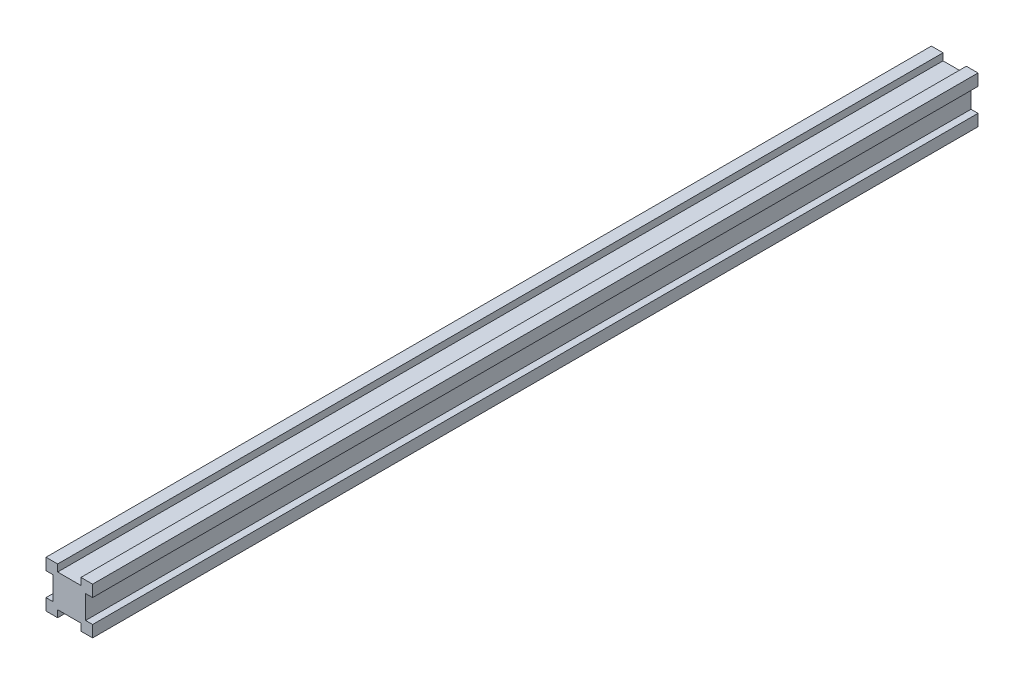
ISO-10303-21;
HEADER;
FILE_DESCRIPTION(('STEP AP214'),'2;1');
FILE_NAME('part.step','',(''),(''),'','','');
FILE_SCHEMA(('AUTOMOTIVE_DESIGN { 1 0 10303 214 1 1 1 1 }'));
ENDSEC;
DATA;
#1=APPLICATION_CONTEXT('core data for automotive mechanical design processes');
#2=APPLICATION_PROTOCOL_DEFINITION('international standard','automotive_design',2000,#1);
#3=PRODUCT_CONTEXT('',#1,'mechanical');
#4=PRODUCT('Part','Part','',(#3));
#5=PRODUCT_RELATED_PRODUCT_CATEGORY('part','',(#4));
#6=PRODUCT_DEFINITION_FORMATION('','',#4);
#7=PRODUCT_DEFINITION_CONTEXT('part definition',#1,'design');
#8=PRODUCT_DEFINITION('design','',#6,#7);
#9=PRODUCT_DEFINITION_SHAPE('','',#8);
#10=(LENGTH_UNIT() NAMED_UNIT(*) SI_UNIT(.MILLI.,.METRE.));
#11=(NAMED_UNIT(*) PLANE_ANGLE_UNIT() SI_UNIT($,.RADIAN.));
#12=(NAMED_UNIT(*) SI_UNIT($,.STERADIAN.) SOLID_ANGLE_UNIT());
#13=UNCERTAINTY_MEASURE_WITH_UNIT(LENGTH_MEASURE(1.E-05),#10,'distance_accuracy_value','');
#14=(GEOMETRIC_REPRESENTATION_CONTEXT(3) GLOBAL_UNCERTAINTY_ASSIGNED_CONTEXT((#13)) GLOBAL_UNIT_ASSIGNED_CONTEXT((#10,
#11,#12)) REPRESENTATION_CONTEXT('',''));
#15=CARTESIAN_POINT('',(0.,0.,0.));
#16=DIRECTION('',(0.,0.,1.));
#17=DIRECTION('',(1.,0.,0.));
#18=AXIS2_PLACEMENT_3D('',#15,#16,#17);
#19=CARTESIAN_POINT('',(-10.,0.,190.));
#20=DIRECTION('',(-1.,0.,0.));
#21=DIRECTION('',(0.,-1.,0.));
#22=AXIS2_PLACEMENT_3D('',#19,#20,#21);
#23=PLANE('',#22);
#24=DIRECTION('',(0.,1.,0.));
#25=VECTOR('',#24,1.);
#26=CARTESIAN_POINT('',(-10.,0.,-190.));
#27=LINE('',#26,#25);
#28=CARTESIAN_POINT('',(-10.,5.,-190.));
#29=VERTEX_POINT('',#28);
#30=CARTESIAN_POINT('',(-10.,10.,-190.));
#31=VERTEX_POINT('',#30);
#32=EDGE_CURVE('E204',#29,#31,#27,.T.);
#33=ORIENTED_EDGE('',*,*,#32,.F.);
#34=DIRECTION('',(0.,0.,-1.));
#35=VECTOR('',#34,1.);
#36=CARTESIAN_POINT('',(-10.,5.,190.));
#37=LINE('',#36,#35);
#38=CARTESIAN_POINT('',(-10.,5.,190.));
#39=VERTEX_POINT('',#38);
#40=EDGE_CURVE('E11',#39,#29,#37,.T.);
#41=ORIENTED_EDGE('',*,*,#40,.F.);
#42=DIRECTION('',(0.,1.,0.));
#43=VECTOR('',#42,1.);
#44=CARTESIAN_POINT('',(-10.,0.,190.));
#45=LINE('',#44,#43);
#46=CARTESIAN_POINT('',(-10.,10.,190.));
#47=VERTEX_POINT('',#46);
#48=EDGE_CURVE('E258',#39,#47,#45,.T.);
#49=ORIENTED_EDGE('',*,*,#48,.T.);
#50=DIRECTION('',(0.,0.,-1.));
#51=VECTOR('',#50,1.);
#52=CARTESIAN_POINT('',(-10.,10.,190.));
#53=LINE('',#52,#51);
#54=EDGE_CURVE('E55',#47,#31,#53,.T.);
#55=ORIENTED_EDGE('',*,*,#54,.T.);
#56=EDGE_LOOP('',(#33,#41,#49,#55));
#57=FACE_BOUND('',#56,.T.);
#58=ADVANCED_FACE('F39',(#57),#23,.T.);
#59=CARTESIAN_POINT('',(0.,5.,190.));
#60=DIRECTION('',(0.,-1.,0.));
#61=DIRECTION('',(1.,0.,0.));
#62=AXIS2_PLACEMENT_3D('',#59,#60,#61);
#63=PLANE('',#62);
#64=DIRECTION('',(-1.,0.,0.));
#65=VECTOR('',#64,1.);
#66=CARTESIAN_POINT('',(0.,5.,-190.));
#67=LINE('',#66,#65);
#68=CARTESIAN_POINT('',(-7.,5.,-190.));
#69=VERTEX_POINT('',#68);
#70=EDGE_CURVE('E206',#69,#29,#67,.T.);
#71=ORIENTED_EDGE('',*,*,#70,.F.);
#72=DIRECTION('',(0.,0.,-1.));
#73=VECTOR('',#72,1.);
#74=CARTESIAN_POINT('',(-7.,5.,190.));
#75=LINE('',#74,#73);
#76=CARTESIAN_POINT('',(-7.,5.,190.));
#77=VERTEX_POINT('',#76);
#78=EDGE_CURVE('E47',#77,#69,#75,.T.);
#79=ORIENTED_EDGE('',*,*,#78,.F.);
#80=DIRECTION('',(-1.,0.,0.));
#81=VECTOR('',#80,1.);
#82=CARTESIAN_POINT('',(0.,5.,190.));
#83=LINE('',#82,#81);
#84=EDGE_CURVE('E313',#77,#39,#83,.T.);
#85=ORIENTED_EDGE('',*,*,#84,.T.);
#86=ORIENTED_EDGE('',*,*,#40,.T.);
#87=EDGE_LOOP('',(#71,#79,#85,#86));
#88=FACE_BOUND('',#87,.T.);
#89=ADVANCED_FACE('F300',(#88),#63,.T.);
#90=CARTESIAN_POINT('',(-7.,0.,190.));
#91=DIRECTION('',(-1.,0.,0.));
#92=DIRECTION('',(0.,-1.,0.));
#93=AXIS2_PLACEMENT_3D('',#90,#91,#92);
#94=PLANE('',#93);
#95=DIRECTION('',(0.,1.,0.));
#96=VECTOR('',#95,1.);
#97=CARTESIAN_POINT('',(-7.,0.,-190.));
#98=LINE('',#97,#96);
#99=CARTESIAN_POINT('',(-7.,-5.,-190.));
#100=VERTEX_POINT('',#99);
#101=EDGE_CURVE('E209',#100,#69,#98,.T.);
#102=ORIENTED_EDGE('',*,*,#101,.F.);
#103=DIRECTION('',(0.,0.,-1.));
#104=VECTOR('',#103,1.);
#105=CARTESIAN_POINT('',(-7.,-5.,190.));
#106=LINE('',#105,#104);
#107=CARTESIAN_POINT('',(-7.,-5.,190.));
#108=VERTEX_POINT('',#107);
#109=EDGE_CURVE('E289',#108,#100,#106,.T.);
#110=ORIENTED_EDGE('',*,*,#109,.F.);
#111=DIRECTION('',(0.,1.,0.));
#112=VECTOR('',#111,1.);
#113=CARTESIAN_POINT('',(-7.,0.,190.));
#114=LINE('',#113,#112);
#115=EDGE_CURVE('E296',#108,#77,#114,.T.);
#116=ORIENTED_EDGE('',*,*,#115,.T.);
#117=ORIENTED_EDGE('',*,*,#78,.T.);
#118=EDGE_LOOP('',(#102,#110,#116,#117));
#119=FACE_BOUND('',#118,.T.);
#120=ADVANCED_FACE('F294',(#119),#94,.T.);
#121=CARTESIAN_POINT('',(0.,-5.,190.));
#122=DIRECTION('',(0.,1.,0.));
#123=DIRECTION('',(-1.,0.,0.));
#124=AXIS2_PLACEMENT_3D('',#121,#122,#123);
#125=PLANE('',#124);
#126=DIRECTION('',(1.,0.,0.));
#127=VECTOR('',#126,1.);
#128=CARTESIAN_POINT('',(0.,-5.,-190.));
#129=LINE('',#128,#127);
#130=CARTESIAN_POINT('',(-10.,-5.,-190.));
#131=VERTEX_POINT('',#130);
#132=EDGE_CURVE('E212',#131,#100,#129,.T.);
#133=ORIENTED_EDGE('',*,*,#132,.F.);
#134=DIRECTION('',(0.,0.,-1.));
#135=VECTOR('',#134,1.);
#136=CARTESIAN_POINT('',(-10.,-5.,190.));
#137=LINE('',#136,#135);
#138=CARTESIAN_POINT('',(-10.,-5.,190.));
#139=VERTEX_POINT('',#138);
#140=EDGE_CURVE('E287',#139,#131,#137,.T.);
#141=ORIENTED_EDGE('',*,*,#140,.F.);
#142=DIRECTION('',(1.,0.,0.));
#143=VECTOR('',#142,1.);
#144=CARTESIAN_POINT('',(0.,-5.,190.));
#145=LINE('',#144,#143);
#146=EDGE_CURVE('E310',#139,#108,#145,.T.);
#147=ORIENTED_EDGE('',*,*,#146,.T.);
#148=ORIENTED_EDGE('',*,*,#109,.T.);
#149=EDGE_LOOP('',(#133,#141,#147,#148));
#150=FACE_BOUND('',#149,.T.);
#151=ADVANCED_FACE('F307',(#150),#125,.T.);
#152=CARTESIAN_POINT('',(-9.99999999999999,0.,190.));
#153=DIRECTION('',(-1.,0.,0.));
#154=DIRECTION('',(0.,-1.,0.));
#155=AXIS2_PLACEMENT_3D('',#152,#153,#154);
#156=PLANE('',#155);
#157=DIRECTION('',(0.,1.,0.));
#158=VECTOR('',#157,1.);
#159=CARTESIAN_POINT('',(-9.99999999999999,0.,-190.));
#160=LINE('',#159,#158);
#161=CARTESIAN_POINT('',(-10.,-10.,-190.));
#162=VERTEX_POINT('',#161);
#163=EDGE_CURVE('E215',#162,#131,#160,.T.);
#164=ORIENTED_EDGE('',*,*,#163,.F.);
#165=DIRECTION('',(0.,0.,-1.));
#166=VECTOR('',#165,1.);
#167=CARTESIAN_POINT('',(-10.,-10.,190.));
#168=LINE('',#167,#166);
#169=CARTESIAN_POINT('',(-10.,-10.,190.));
#170=VERTEX_POINT('',#169);
#171=EDGE_CURVE('E285',#170,#162,#168,.T.);
#172=ORIENTED_EDGE('',*,*,#171,.F.);
#173=DIRECTION('',(0.,1.,0.));
#174=VECTOR('',#173,1.);
#175=CARTESIAN_POINT('',(-9.99999999999999,0.,190.));
#176=LINE('',#175,#174);
#177=EDGE_CURVE('E315',#170,#139,#176,.T.);
#178=ORIENTED_EDGE('',*,*,#177,.T.);
#179=ORIENTED_EDGE('',*,*,#140,.T.);
#180=EDGE_LOOP('',(#164,#172,#178,#179));
#181=FACE_BOUND('',#180,.T.);
#182=ADVANCED_FACE('F373',(#181),#156,.T.);
#183=CARTESIAN_POINT('',(0.,-10.,190.));
#184=DIRECTION('',(0.,1.,0.));
#185=DIRECTION('',(0.,0.,1.));
#186=AXIS2_PLACEMENT_3D('',#183,#184,#185);
#187=PLANE('',#186);
#188=DIRECTION('',(1.,0.,0.));
#189=VECTOR('',#188,1.);
#190=CARTESIAN_POINT('',(0.,-10.,-190.));
#191=LINE('',#190,#189);
#192=CARTESIAN_POINT('',(-5.,-10.,-190.));
#193=VERTEX_POINT('',#192);
#194=EDGE_CURVE('E218',#162,#193,#191,.T.);
#195=ORIENTED_EDGE('',*,*,#194,.T.);
#196=DIRECTION('',(0.,0.,-1.));
#197=VECTOR('',#196,1.);
#198=CARTESIAN_POINT('',(-5.,-10.,190.));
#199=LINE('',#198,#197);
#200=CARTESIAN_POINT('',(-5.,-10.,190.));
#201=VERTEX_POINT('',#200);
#202=EDGE_CURVE('E283',#201,#193,#199,.T.);
#203=ORIENTED_EDGE('',*,*,#202,.F.);
#204=DIRECTION('',(1.,0.,0.));
#205=VECTOR('',#204,1.);
#206=CARTESIAN_POINT('',(0.,-10.,190.));
#207=LINE('',#206,#205);
#208=EDGE_CURVE('E321',#170,#201,#207,.T.);
#209=ORIENTED_EDGE('',*,*,#208,.F.);
#210=ORIENTED_EDGE('',*,*,#171,.T.);
#211=EDGE_LOOP('',(#195,#203,#209,#210));
#212=FACE_BOUND('',#211,.T.);
#213=ADVANCED_FACE('F376',(#212),#187,.F.);
#214=CARTESIAN_POINT('',(-5.,0.,190.));
#215=DIRECTION('',(1.,0.,0.));
#216=DIRECTION('',(0.,0.,-1.));
#217=AXIS2_PLACEMENT_3D('',#214,#215,#216);
#218=PLANE('',#217);
#219=DIRECTION('',(0.,-1.,0.));
#220=VECTOR('',#219,1.);
#221=CARTESIAN_POINT('',(-5.,0.,-190.));
#222=LINE('',#221,#220);
#223=CARTESIAN_POINT('',(-5.,-7.,-190.));
#224=VERTEX_POINT('',#223);
#225=EDGE_CURVE('E221',#224,#193,#222,.T.);
#226=ORIENTED_EDGE('',*,*,#225,.F.);
#227=DIRECTION('',(0.,0.,-1.));
#228=VECTOR('',#227,1.);
#229=CARTESIAN_POINT('',(-5.,-7.,190.));
#230=LINE('',#229,#228);
#231=CARTESIAN_POINT('',(-5.,-7.,190.));
#232=VERTEX_POINT('',#231);
#233=EDGE_CURVE('E281',#232,#224,#230,.T.);
#234=ORIENTED_EDGE('',*,*,#233,.F.);
#235=DIRECTION('',(0.,-1.,0.));
#236=VECTOR('',#235,1.);
#237=CARTESIAN_POINT('',(-5.,0.,190.));
#238=LINE('',#237,#236);
#239=EDGE_CURVE('E323',#232,#201,#238,.T.);
#240=ORIENTED_EDGE('',*,*,#239,.T.);
#241=ORIENTED_EDGE('',*,*,#202,.T.);
#242=EDGE_LOOP('',(#226,#234,#240,#241));
#243=FACE_BOUND('',#242,.T.);
#244=ADVANCED_FACE('F378',(#243),#218,.T.);
#245=CARTESIAN_POINT('',(0.,-7.,190.));
#246=DIRECTION('',(0.,-1.,0.));
#247=DIRECTION('',(1.,0.,0.));
#248=AXIS2_PLACEMENT_3D('',#245,#246,#247);
#249=PLANE('',#248);
#250=DIRECTION('',(-1.,0.,0.));
#251=VECTOR('',#250,1.);
#252=CARTESIAN_POINT('',(0.,-7.,-190.));
#253=LINE('',#252,#251);
#254=CARTESIAN_POINT('',(5.,-7.,-190.));
#255=VERTEX_POINT('',#254);
#256=EDGE_CURVE('E225',#255,#224,#253,.T.);
#257=ORIENTED_EDGE('',*,*,#256,.F.);
#258=DIRECTION('',(0.,0.,-1.));
#259=VECTOR('',#258,1.);
#260=CARTESIAN_POINT('',(5.,-7.,190.));
#261=LINE('',#260,#259);
#262=CARTESIAN_POINT('',(5.,-7.,190.));
#263=VERTEX_POINT('',#262);
#264=EDGE_CURVE('E279',#263,#255,#261,.T.);
#265=ORIENTED_EDGE('',*,*,#264,.F.);
#266=DIRECTION('',(-1.,0.,0.));
#267=VECTOR('',#266,1.);
#268=CARTESIAN_POINT('',(0.,-7.,190.));
#269=LINE('',#268,#267);
#270=EDGE_CURVE('E327',#263,#232,#269,.T.);
#271=ORIENTED_EDGE('',*,*,#270,.T.);
#272=ORIENTED_EDGE('',*,*,#233,.T.);
#273=EDGE_LOOP('',(#257,#265,#271,#272));
#274=FACE_BOUND('',#273,.T.);
#275=ADVANCED_FACE('F381',(#274),#249,.T.);
#276=CARTESIAN_POINT('',(5.,0.,190.));
#277=DIRECTION('',(-1.,0.,0.));
#278=DIRECTION('',(0.,0.,1.));
#279=AXIS2_PLACEMENT_3D('',#276,#277,#278);
#280=PLANE('',#279);
#281=DIRECTION('',(0.,1.,0.));
#282=VECTOR('',#281,1.);
#283=CARTESIAN_POINT('',(5.,0.,-190.));
#284=LINE('',#283,#282);
#285=CARTESIAN_POINT('',(5.,-10.,-190.));
#286=VERTEX_POINT('',#285);
#287=EDGE_CURVE('E228',#286,#255,#284,.T.);
#288=ORIENTED_EDGE('',*,*,#287,.F.);
#289=DIRECTION('',(0.,0.,-1.));
#290=VECTOR('',#289,1.);
#291=CARTESIAN_POINT('',(5.,-10.,190.));
#292=LINE('',#291,#290);
#293=CARTESIAN_POINT('',(5.,-10.,190.));
#294=VERTEX_POINT('',#293);
#295=EDGE_CURVE('E277',#294,#286,#292,.T.);
#296=ORIENTED_EDGE('',*,*,#295,.F.);
#297=DIRECTION('',(0.,1.,0.));
#298=VECTOR('',#297,1.);
#299=CARTESIAN_POINT('',(5.,0.,190.));
#300=LINE('',#299,#298);
#301=EDGE_CURVE('E330',#294,#263,#300,.T.);
#302=ORIENTED_EDGE('',*,*,#301,.T.);
#303=ORIENTED_EDGE('',*,*,#264,.T.);
#304=EDGE_LOOP('',(#288,#296,#302,#303));
#305=FACE_BOUND('',#304,.T.);
#306=ADVANCED_FACE('F385',(#305),#280,.T.);
#307=CARTESIAN_POINT('',(10.,-10.,-190.));
#308=VERTEX_POINT('',#307);
#309=EDGE_CURVE('E222',#286,#308,#191,.T.);
#310=ORIENTED_EDGE('',*,*,#309,.T.);
#311=DIRECTION('',(0.,0.,-1.));
#312=VECTOR('',#311,1.);
#313=CARTESIAN_POINT('',(10.,-10.,190.));
#314=LINE('',#313,#312);
#315=CARTESIAN_POINT('',(10.,-10.,190.));
#316=VERTEX_POINT('',#315);
#317=EDGE_CURVE('E274',#316,#308,#314,.T.);
#318=ORIENTED_EDGE('',*,*,#317,.F.);
#319=EDGE_CURVE('E324',#294,#316,#207,.T.);
#320=ORIENTED_EDGE('',*,*,#319,.F.);
#321=ORIENTED_EDGE('',*,*,#295,.T.);
#322=EDGE_LOOP('',(#310,#318,#320,#321));
#323=FACE_BOUND('',#322,.T.);
#324=ADVANCED_FACE('F389',(#323),#187,.F.);
#325=CARTESIAN_POINT('',(10.,0.,190.));
#326=DIRECTION('',(-1.,0.,0.));
#327=DIRECTION('',(0.,0.,1.));
#328=AXIS2_PLACEMENT_3D('',#325,#326,#327);
#329=PLANE('',#328);
#330=DIRECTION('',(0.,1.,0.));
#331=VECTOR('',#330,1.);
#332=CARTESIAN_POINT('',(10.,0.,-190.));
#333=LINE('',#332,#331);
#334=CARTESIAN_POINT('',(10.,-5.,-190.));
#335=VERTEX_POINT('',#334);
#336=EDGE_CURVE('E231',#308,#335,#333,.T.);
#337=ORIENTED_EDGE('',*,*,#336,.T.);
#338=DIRECTION('',(0.,0.,-1.));
#339=VECTOR('',#338,1.);
#340=CARTESIAN_POINT('',(10.,-5.,190.));
#341=LINE('',#340,#339);
#342=CARTESIAN_POINT('',(10.,-5.,190.));
#343=VERTEX_POINT('',#342);
#344=EDGE_CURVE('E272',#343,#335,#341,.T.);
#345=ORIENTED_EDGE('',*,*,#344,.F.);
#346=DIRECTION('',(0.,1.,0.));
#347=VECTOR('',#346,1.);
#348=CARTESIAN_POINT('',(10.,0.,190.));
#349=LINE('',#348,#347);
#350=EDGE_CURVE('E333',#316,#343,#349,.T.);
#351=ORIENTED_EDGE('',*,*,#350,.F.);
#352=ORIENTED_EDGE('',*,*,#317,.T.);
#353=EDGE_LOOP('',(#337,#345,#351,#352));
#354=FACE_BOUND('',#353,.T.);
#355=ADVANCED_FACE('F393',(#354),#329,.F.);
#356=CARTESIAN_POINT('',(0.,-5.,190.));
#357=DIRECTION('',(0.,1.,0.));
#358=DIRECTION('',(-1.,0.,0.));
#359=AXIS2_PLACEMENT_3D('',#356,#357,#358);
#360=PLANE('',#359);
#361=DIRECTION('',(1.,0.,0.));
#362=VECTOR('',#361,1.);
#363=CARTESIAN_POINT('',(0.,-5.,-190.));
#364=LINE('',#363,#362);
#365=CARTESIAN_POINT('',(7.,-5.,-190.));
#366=VERTEX_POINT('',#365);
#367=EDGE_CURVE('E234',#366,#335,#364,.T.);
#368=ORIENTED_EDGE('',*,*,#367,.F.);
#369=DIRECTION('',(0.,0.,-1.));
#370=VECTOR('',#369,1.);
#371=CARTESIAN_POINT('',(7.,-5.,190.));
#372=LINE('',#371,#370);
#373=CARTESIAN_POINT('',(7.,-5.,190.));
#374=VERTEX_POINT('',#373);
#375=EDGE_CURVE('E270',#374,#366,#372,.T.);
#376=ORIENTED_EDGE('',*,*,#375,.F.);
#377=DIRECTION('',(1.,0.,0.));
#378=VECTOR('',#377,1.);
#379=CARTESIAN_POINT('',(0.,-5.,190.));
#380=LINE('',#379,#378);
#381=EDGE_CURVE('E335',#374,#343,#380,.T.);
#382=ORIENTED_EDGE('',*,*,#381,.T.);
#383=ORIENTED_EDGE('',*,*,#344,.T.);
#384=EDGE_LOOP('',(#368,#376,#382,#383));
#385=FACE_BOUND('',#384,.T.);
#386=ADVANCED_FACE('F397',(#385),#360,.T.);
#387=CARTESIAN_POINT('',(7.,0.,190.));
#388=DIRECTION('',(1.,0.,0.));
#389=DIRECTION('',(0.,0.,-1.));
#390=AXIS2_PLACEMENT_3D('',#387,#388,#389);
#391=PLANE('',#390);
#392=DIRECTION('',(0.,-1.,0.));
#393=VECTOR('',#392,1.);
#394=CARTESIAN_POINT('',(7.,0.,-190.));
#395=LINE('',#394,#393);
#396=CARTESIAN_POINT('',(7.,5.,-190.));
#397=VERTEX_POINT('',#396);
#398=EDGE_CURVE('E237',#397,#366,#395,.T.);
#399=ORIENTED_EDGE('',*,*,#398,.F.);
#400=DIRECTION('',(0.,0.,-1.));
#401=VECTOR('',#400,1.);
#402=CARTESIAN_POINT('',(7.,5.,190.));
#403=LINE('',#402,#401);
#404=CARTESIAN_POINT('',(7.,5.,190.));
#405=VERTEX_POINT('',#404);
#406=EDGE_CURVE('E268',#405,#397,#403,.T.);
#407=ORIENTED_EDGE('',*,*,#406,.F.);
#408=DIRECTION('',(0.,-1.,0.));
#409=VECTOR('',#408,1.);
#410=CARTESIAN_POINT('',(7.,0.,190.));
#411=LINE('',#410,#409);
#412=EDGE_CURVE('E338',#405,#374,#411,.T.);
#413=ORIENTED_EDGE('',*,*,#412,.T.);
#414=ORIENTED_EDGE('',*,*,#375,.T.);
#415=EDGE_LOOP('',(#399,#407,#413,#414));
#416=FACE_BOUND('',#415,.T.);
#417=ADVANCED_FACE('F401',(#416),#391,.T.);
#418=CARTESIAN_POINT('',(0.,5.,190.));
#419=DIRECTION('',(0.,-1.,0.));
#420=DIRECTION('',(1.,0.,0.));
#421=AXIS2_PLACEMENT_3D('',#418,#419,#420);
#422=PLANE('',#421);
#423=DIRECTION('',(-1.,0.,0.));
#424=VECTOR('',#423,1.);
#425=CARTESIAN_POINT('',(0.,5.,-190.));
#426=LINE('',#425,#424);
#427=CARTESIAN_POINT('',(10.,5.,-190.));
#428=VERTEX_POINT('',#427);
#429=EDGE_CURVE('E240',#428,#397,#426,.T.);
#430=ORIENTED_EDGE('',*,*,#429,.F.);
#431=DIRECTION('',(0.,0.,-1.));
#432=VECTOR('',#431,1.);
#433=CARTESIAN_POINT('',(10.,5.,190.));
#434=LINE('',#433,#432);
#435=CARTESIAN_POINT('',(10.,5.,190.));
#436=VERTEX_POINT('',#435);
#437=EDGE_CURVE('E266',#436,#428,#434,.T.);
#438=ORIENTED_EDGE('',*,*,#437,.F.);
#439=DIRECTION('',(-1.,0.,0.));
#440=VECTOR('',#439,1.);
#441=CARTESIAN_POINT('',(0.,5.,190.));
#442=LINE('',#441,#440);
#443=EDGE_CURVE('E341',#436,#405,#442,.T.);
#444=ORIENTED_EDGE('',*,*,#443,.T.);
#445=ORIENTED_EDGE('',*,*,#406,.T.);
#446=EDGE_LOOP('',(#430,#438,#444,#445));
#447=FACE_BOUND('',#446,.T.);
#448=ADVANCED_FACE('F405',(#447),#422,.T.);
#449=CARTESIAN_POINT('',(10.,0.,190.));
#450=DIRECTION('',(-1.,0.,0.));
#451=DIRECTION('',(0.,0.,1.));
#452=AXIS2_PLACEMENT_3D('',#449,#450,#451);
#453=PLANE('',#452);
#454=DIRECTION('',(0.,1.,0.));
#455=VECTOR('',#454,1.);
#456=CARTESIAN_POINT('',(10.,0.,-190.));
#457=LINE('',#456,#455);
#458=CARTESIAN_POINT('',(10.,10.,-190.));
#459=VERTEX_POINT('',#458);
#460=EDGE_CURVE('E243',#428,#459,#457,.T.);
#461=ORIENTED_EDGE('',*,*,#460,.T.);
#462=DIRECTION('',(0.,0.,-1.));
#463=VECTOR('',#462,1.);
#464=CARTESIAN_POINT('',(10.,10.,190.));
#465=LINE('',#464,#463);
#466=CARTESIAN_POINT('',(10.,10.,190.));
#467=VERTEX_POINT('',#466);
#468=EDGE_CURVE('E264',#467,#459,#465,.T.);
#469=ORIENTED_EDGE('',*,*,#468,.F.);
#470=DIRECTION('',(0.,1.,0.));
#471=VECTOR('',#470,1.);
#472=CARTESIAN_POINT('',(10.,0.,190.));
#473=LINE('',#472,#471);
#474=EDGE_CURVE('E344',#436,#467,#473,.T.);
#475=ORIENTED_EDGE('',*,*,#474,.F.);
#476=ORIENTED_EDGE('',*,*,#437,.T.);
#477=EDGE_LOOP('',(#461,#469,#475,#476));
#478=FACE_BOUND('',#477,.T.);
#479=ADVANCED_FACE('F409',(#478),#453,.F.);
#480=CARTESIAN_POINT('',(0.,10.,190.));
#481=DIRECTION('',(0.,1.,0.));
#482=DIRECTION('',(0.,0.,1.));
#483=AXIS2_PLACEMENT_3D('',#480,#481,#482);
#484=PLANE('',#483);
#485=DIRECTION('',(1.,0.,0.));
#486=VECTOR('',#485,1.);
#487=CARTESIAN_POINT('',(0.,10.,-190.));
#488=LINE('',#487,#486);
#489=CARTESIAN_POINT('',(5.,10.,-190.));
#490=VERTEX_POINT('',#489);
#491=EDGE_CURVE('E246',#490,#459,#488,.T.);
#492=ORIENTED_EDGE('',*,*,#491,.F.);
#493=DIRECTION('',(0.,0.,-1.));
#494=VECTOR('',#493,1.);
#495=CARTESIAN_POINT('',(5.,10.,190.));
#496=LINE('',#495,#494);
#497=CARTESIAN_POINT('',(5.,10.,190.));
#498=VERTEX_POINT('',#497);
#499=EDGE_CURVE('E262',#498,#490,#496,.T.);
#500=ORIENTED_EDGE('',*,*,#499,.F.);
#501=DIRECTION('',(1.,0.,0.));
#502=VECTOR('',#501,1.);
#503=CARTESIAN_POINT('',(0.,10.,190.));
#504=LINE('',#503,#502);
#505=EDGE_CURVE('E346',#498,#467,#504,.T.);
#506=ORIENTED_EDGE('',*,*,#505,.T.);
#507=ORIENTED_EDGE('',*,*,#468,.T.);
#508=EDGE_LOOP('',(#492,#500,#506,#507));
#509=FACE_BOUND('',#508,.T.);
#510=ADVANCED_FACE('F413',(#509),#484,.T.);
#511=CARTESIAN_POINT('',(5.,0.,190.));
#512=DIRECTION('',(-1.,0.,0.));
#513=DIRECTION('',(0.,-1.,0.));
#514=AXIS2_PLACEMENT_3D('',#511,#512,#513);
#515=PLANE('',#514);
#516=DIRECTION('',(0.,1.,0.));
#517=VECTOR('',#516,1.);
#518=CARTESIAN_POINT('',(5.,0.,-190.));
#519=LINE('',#518,#517);
#520=CARTESIAN_POINT('',(5.,7.,-190.));
#521=VERTEX_POINT('',#520);
#522=EDGE_CURVE('E249',#521,#490,#519,.T.);
#523=ORIENTED_EDGE('',*,*,#522,.F.);
#524=DIRECTION('',(0.,0.,-1.));
#525=VECTOR('',#524,1.);
#526=CARTESIAN_POINT('',(5.,7.,190.));
#527=LINE('',#526,#525);
#528=CARTESIAN_POINT('',(5.,7.,190.));
#529=VERTEX_POINT('',#528);
#530=EDGE_CURVE('E186',#529,#521,#527,.T.);
#531=ORIENTED_EDGE('',*,*,#530,.F.);
#532=DIRECTION('',(0.,1.,0.));
#533=VECTOR('',#532,1.);
#534=CARTESIAN_POINT('',(5.,0.,190.));
#535=LINE('',#534,#533);
#536=EDGE_CURVE('E196',#529,#498,#535,.T.);
#537=ORIENTED_EDGE('',*,*,#536,.T.);
#538=ORIENTED_EDGE('',*,*,#499,.T.);
#539=EDGE_LOOP('',(#523,#531,#537,#538));
#540=FACE_BOUND('',#539,.T.);
#541=ADVANCED_FACE('F350',(#540),#515,.T.);
#542=CARTESIAN_POINT('',(0.,7.,190.));
#543=DIRECTION('',(0.,1.,0.));
#544=DIRECTION('',(0.,0.,1.));
#545=AXIS2_PLACEMENT_3D('',#542,#543,#544);
#546=PLANE('',#545);
#547=DIRECTION('',(1.,0.,0.));
#548=VECTOR('',#547,1.);
#549=CARTESIAN_POINT('',(0.,7.,-190.));
#550=LINE('',#549,#548);
#551=CARTESIAN_POINT('',(-5.,7.,-190.));
#552=VERTEX_POINT('',#551);
#553=EDGE_CURVE('E182',#552,#521,#550,.T.);
#554=ORIENTED_EDGE('',*,*,#553,.F.);
#555=DIRECTION('',(0.,0.,-1.));
#556=VECTOR('',#555,1.);
#557=CARTESIAN_POINT('',(-5.,7.,190.));
#558=LINE('',#557,#556);
#559=CARTESIAN_POINT('',(-5.,7.,190.));
#560=VERTEX_POINT('',#559);
#561=EDGE_CURVE('E177',#560,#552,#558,.T.);
#562=ORIENTED_EDGE('',*,*,#561,.F.);
#563=DIRECTION('',(1.,0.,0.));
#564=VECTOR('',#563,1.);
#565=CARTESIAN_POINT('',(0.,7.,190.));
#566=LINE('',#565,#564);
#567=EDGE_CURVE('E180',#560,#529,#566,.T.);
#568=ORIENTED_EDGE('',*,*,#567,.T.);
#569=ORIENTED_EDGE('',*,*,#530,.T.);
#570=EDGE_LOOP('',(#554,#562,#568,#569));
#571=FACE_BOUND('',#570,.T.);
#572=ADVANCED_FACE('F179',(#571),#546,.T.);
#573=CARTESIAN_POINT('',(-5.,0.,190.));
#574=DIRECTION('',(1.,0.,0.));
#575=DIRECTION('',(0.,1.,0.));
#576=AXIS2_PLACEMENT_3D('',#573,#574,#575);
#577=PLANE('',#576);
#578=DIRECTION('',(0.,-1.,0.));
#579=VECTOR('',#578,1.);
#580=CARTESIAN_POINT('',(-5.,0.,-190.));
#581=LINE('',#580,#579);
#582=CARTESIAN_POINT('',(-5.,10.,-190.));
#583=VERTEX_POINT('',#582);
#584=EDGE_CURVE('E253',#583,#552,#581,.T.);
#585=ORIENTED_EDGE('',*,*,#584,.F.);
#586=DIRECTION('',(0.,0.,-1.));
#587=VECTOR('',#586,1.);
#588=CARTESIAN_POINT('',(-5.,10.,190.));
#589=LINE('',#588,#587);
#590=CARTESIAN_POINT('',(-5.,10.,190.));
#591=VERTEX_POINT('',#590);
#592=EDGE_CURVE('E116',#591,#583,#589,.T.);
#593=ORIENTED_EDGE('',*,*,#592,.F.);
#594=DIRECTION('',(0.,-1.,0.));
#595=VECTOR('',#594,1.);
#596=CARTESIAN_POINT('',(-5.,0.,190.));
#597=LINE('',#596,#595);
#598=EDGE_CURVE('E193',#591,#560,#597,.T.);
#599=ORIENTED_EDGE('',*,*,#598,.T.);
#600=ORIENTED_EDGE('',*,*,#561,.T.);
#601=EDGE_LOOP('',(#585,#593,#599,#600));
#602=FACE_BOUND('',#601,.T.);
#603=ADVANCED_FACE('F198',(#602),#577,.T.);
#604=CARTESIAN_POINT('',(0.,10.,190.));
#605=DIRECTION('',(0.,1.,0.));
#606=DIRECTION('',(0.,0.,1.));
#607=AXIS2_PLACEMENT_3D('',#604,#605,#606);
#608=PLANE('',#607);
#609=DIRECTION('',(1.,0.,0.));
#610=VECTOR('',#609,1.);
#611=CARTESIAN_POINT('',(0.,10.,-190.));
#612=LINE('',#611,#610);
#613=EDGE_CURVE('E255',#31,#583,#612,.T.);
#614=ORIENTED_EDGE('',*,*,#613,.F.);
#615=ORIENTED_EDGE('',*,*,#54,.F.);
#616=DIRECTION('',(1.,0.,0.));
#617=VECTOR('',#616,1.);
#618=CARTESIAN_POINT('',(0.,10.,190.));
#619=LINE('',#618,#617);
#620=EDGE_CURVE('E199',#47,#591,#619,.T.);
#621=ORIENTED_EDGE('',*,*,#620,.T.);
#622=ORIENTED_EDGE('',*,*,#592,.T.);
#623=EDGE_LOOP('',(#614,#615,#621,#622));
#624=FACE_BOUND('',#623,.T.);
#625=ADVANCED_FACE('F352',(#624),#608,.T.);
#626=CARTESIAN_POINT('',(0.,0.,190.));
#627=DIRECTION('',(0.,0.,1.));
#628=DIRECTION('',(1.,0.,0.));
#629=AXIS2_PLACEMENT_3D('',#626,#627,#628);
#630=PLANE('',#629);
#631=ORIENTED_EDGE('',*,*,#48,.F.);
#632=ORIENTED_EDGE('',*,*,#84,.F.);
#633=ORIENTED_EDGE('',*,*,#115,.F.);
#634=ORIENTED_EDGE('',*,*,#146,.F.);
#635=ORIENTED_EDGE('',*,*,#177,.F.);
#636=ORIENTED_EDGE('',*,*,#208,.T.);
#637=ORIENTED_EDGE('',*,*,#239,.F.);
#638=ORIENTED_EDGE('',*,*,#270,.F.);
#639=ORIENTED_EDGE('',*,*,#301,.F.);
#640=ORIENTED_EDGE('',*,*,#319,.T.);
#641=ORIENTED_EDGE('',*,*,#350,.T.);
#642=ORIENTED_EDGE('',*,*,#381,.F.);
#643=ORIENTED_EDGE('',*,*,#412,.F.);
#644=ORIENTED_EDGE('',*,*,#443,.F.);
#645=ORIENTED_EDGE('',*,*,#474,.T.);
#646=ORIENTED_EDGE('',*,*,#505,.F.);
#647=ORIENTED_EDGE('',*,*,#536,.F.);
#648=ORIENTED_EDGE('',*,*,#567,.F.);
#649=ORIENTED_EDGE('',*,*,#598,.F.);
#650=ORIENTED_EDGE('',*,*,#620,.F.);
#651=EDGE_LOOP('',(#631,#632,#633,#634,#635,#636,#637,#638,#639,#640,#641,#642,#643,#644,#645,
#646,#647,#648,#649,#650));
#652=FACE_BOUND('',#651,.T.);
#653=ADVANCED_FACE('F191',(#652),#630,.T.);
#654=CARTESIAN_POINT('',(0.,0.,-190.));
#655=DIRECTION('',(0.,0.,1.));
#656=DIRECTION('',(1.,0.,0.));
#657=AXIS2_PLACEMENT_3D('',#654,#655,#656);
#658=PLANE('',#657);
#659=ORIENTED_EDGE('',*,*,#32,.T.);
#660=ORIENTED_EDGE('',*,*,#613,.T.);
#661=ORIENTED_EDGE('',*,*,#584,.T.);
#662=ORIENTED_EDGE('',*,*,#553,.T.);
#663=ORIENTED_EDGE('',*,*,#522,.T.);
#664=ORIENTED_EDGE('',*,*,#491,.T.);
#665=ORIENTED_EDGE('',*,*,#460,.F.);
#666=ORIENTED_EDGE('',*,*,#429,.T.);
#667=ORIENTED_EDGE('',*,*,#398,.T.);
#668=ORIENTED_EDGE('',*,*,#367,.T.);
#669=ORIENTED_EDGE('',*,*,#336,.F.);
#670=ORIENTED_EDGE('',*,*,#309,.F.);
#671=ORIENTED_EDGE('',*,*,#287,.T.);
#672=ORIENTED_EDGE('',*,*,#256,.T.);
#673=ORIENTED_EDGE('',*,*,#225,.T.);
#674=ORIENTED_EDGE('',*,*,#194,.F.);
#675=ORIENTED_EDGE('',*,*,#163,.T.);
#676=ORIENTED_EDGE('',*,*,#132,.T.);
#677=ORIENTED_EDGE('',*,*,#101,.T.);
#678=ORIENTED_EDGE('',*,*,#70,.T.);
#679=EDGE_LOOP('',(#659,#660,#661,#662,#663,#664,#665,#666,#667,#668,#669,#670,#671,#672,#673,
#674,#675,#676,#677,#678));
#680=FACE_BOUND('',#679,.T.);
#681=ADVANCED_FACE('F302',(#680),#658,.F.);
#682=CLOSED_SHELL('',(#58,#89,#120,#151,#182,#213,#244,#275,#306,#324,#355,#386,#417,#448,#479,
#510,#541,#572,#603,#625,#653,#681));
#683=MANIFOLD_SOLID_BREP('B2',#682);
#684=ADVANCED_BREP_SHAPE_REPRESENTATION('',(#18,#683),#14);
#685=SHAPE_DEFINITION_REPRESENTATION(#9,#684);
ENDSEC;
END-ISO-10303-21;
